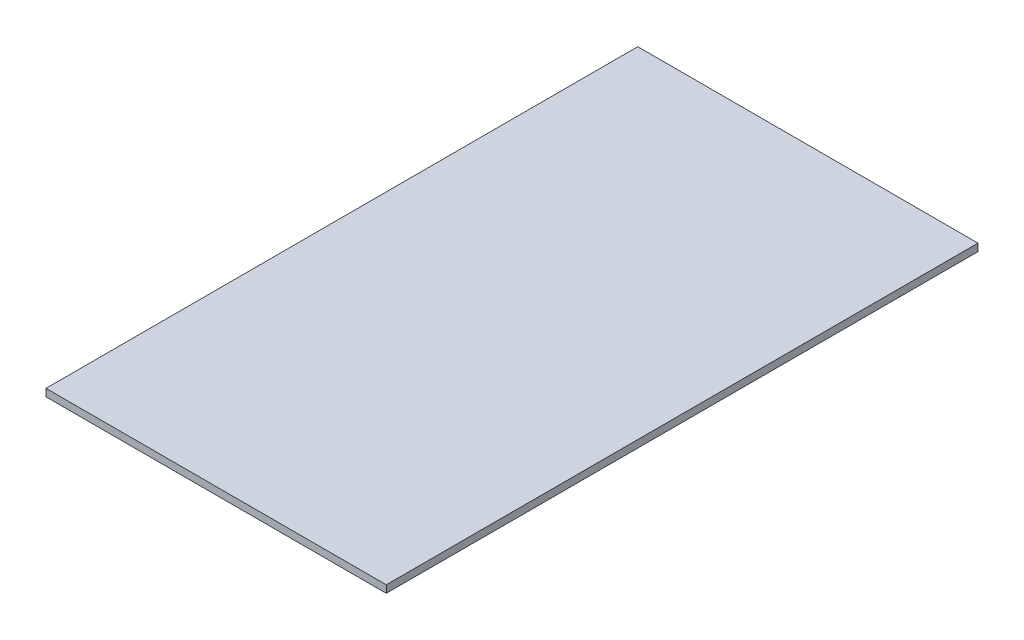
ISO-10303-21;
HEADER;
FILE_DESCRIPTION(('STEP AP214'),'2;1');
FILE_NAME('part.step','',(''),(''),'','','');
FILE_SCHEMA(('AUTOMOTIVE_DESIGN { 1 0 10303 214 1 1 1 1 }'));
ENDSEC;
DATA;
#1=APPLICATION_CONTEXT('core data for automotive mechanical design processes');
#2=APPLICATION_PROTOCOL_DEFINITION('international standard','automotive_design',2000,#1);
#3=PRODUCT_CONTEXT('',#1,'mechanical');
#4=PRODUCT('Part','Part','',(#3));
#5=PRODUCT_RELATED_PRODUCT_CATEGORY('part','',(#4));
#6=PRODUCT_DEFINITION_FORMATION('','',#4);
#7=PRODUCT_DEFINITION_CONTEXT('part definition',#1,'design');
#8=PRODUCT_DEFINITION('design','',#6,#7);
#9=PRODUCT_DEFINITION_SHAPE('','',#8);
#10=(LENGTH_UNIT() NAMED_UNIT(*) SI_UNIT(.MILLI.,.METRE.));
#11=(NAMED_UNIT(*) PLANE_ANGLE_UNIT() SI_UNIT($,.RADIAN.));
#12=(NAMED_UNIT(*) SI_UNIT($,.STERADIAN.) SOLID_ANGLE_UNIT());
#13=UNCERTAINTY_MEASURE_WITH_UNIT(LENGTH_MEASURE(1.E-05),#10,'distance_accuracy_value','');
#14=(GEOMETRIC_REPRESENTATION_CONTEXT(3) GLOBAL_UNCERTAINTY_ASSIGNED_CONTEXT((#13)) GLOBAL_UNIT_ASSIGNED_CONTEXT((#10,
#11,#12)) REPRESENTATION_CONTEXT('',''));
#15=CARTESIAN_POINT('',(0.,0.,0.));
#16=DIRECTION('',(0.,0.,1.));
#17=DIRECTION('',(1.,0.,0.));
#18=AXIS2_PLACEMENT_3D('',#15,#16,#17);
#19=CARTESIAN_POINT('',(0.92717059071068,6.35,22.9951434882447));
#20=DIRECTION('',(0.,0.,-1.));
#21=DIRECTION('',(-1.,0.,0.));
#22=AXIS2_PLACEMENT_3D('',#19,#20,#21);
#23=PLANE('',#22);
#24=DIRECTION('',(1.,0.,0.));
#25=VECTOR('',#24,1.);
#26=CARTESIAN_POINT('',(0.92717059071068,0.,22.9951434882447));
#27=LINE('',#26,#25);
#28=CARTESIAN_POINT('',(0.92717059071068,0.,22.9951434882447));
#29=VERTEX_POINT('',#28);
#30=CARTESIAN_POINT('',(293.027170590711,0.,22.9951434882446));
#31=VERTEX_POINT('',#30);
#32=EDGE_CURVE('E107',#29,#31,#27,.T.);
#33=ORIENTED_EDGE('',*,*,#32,.T.);
#34=DIRECTION('',(0.,-1.,0.));
#35=VECTOR('',#34,1.);
#36=CARTESIAN_POINT('',(293.027170590711,6.35,22.9951434882446));
#37=LINE('',#36,#35);
#38=CARTESIAN_POINT('',(293.027170590711,6.35,22.9951434882446));
#39=VERTEX_POINT('',#38);
#40=EDGE_CURVE('E11',#39,#31,#37,.T.);
#41=ORIENTED_EDGE('',*,*,#40,.F.);
#42=DIRECTION('',(1.,0.,0.));
#43=VECTOR('',#42,1.);
#44=CARTESIAN_POINT('',(0.92717059071068,6.35,22.9951434882447));
#45=LINE('',#44,#43);
#46=CARTESIAN_POINT('',(0.92717059071068,6.35,22.9951434882447));
#47=VERTEX_POINT('',#46);
#48=EDGE_CURVE('E89',#47,#39,#45,.T.);
#49=ORIENTED_EDGE('',*,*,#48,.F.);
#50=DIRECTION('',(0.,-1.,0.));
#51=VECTOR('',#50,1.);
#52=CARTESIAN_POINT('',(0.92717059071068,6.35,22.9951434882447));
#53=LINE('',#52,#51);
#54=EDGE_CURVE('E56',#47,#29,#53,.T.);
#55=ORIENTED_EDGE('',*,*,#54,.T.);
#56=EDGE_LOOP('',(#33,#41,#49,#55));
#57=FACE_BOUND('',#56,.T.);
#58=ADVANCED_FACE('F39',(#57),#23,.F.);
#59=CARTESIAN_POINT('',(293.027170590711,6.35,22.9951434882446));
#60=DIRECTION('',(-1.,0.,0.));
#61=DIRECTION('',(0.,0.,1.));
#62=AXIS2_PLACEMENT_3D('',#59,#60,#61);
#63=PLANE('',#62);
#64=DIRECTION('',(0.,0.,-1.));
#65=VECTOR('',#64,1.);
#66=CARTESIAN_POINT('',(293.027170590711,0.,22.9951434882446));
#67=LINE('',#66,#65);
#68=CARTESIAN_POINT('',(293.027170590711,0.,-485.004856511755));
#69=VERTEX_POINT('',#68);
#70=EDGE_CURVE('E95',#31,#69,#67,.T.);
#71=ORIENTED_EDGE('',*,*,#70,.T.);
#72=DIRECTION('',(0.,-1.,0.));
#73=VECTOR('',#72,1.);
#74=CARTESIAN_POINT('',(293.027170590711,6.35,-485.004856511755));
#75=LINE('',#74,#73);
#76=CARTESIAN_POINT('',(293.027170590711,6.35,-485.004856511755));
#77=VERTEX_POINT('',#76);
#78=EDGE_CURVE('E48',#77,#69,#75,.T.);
#79=ORIENTED_EDGE('',*,*,#78,.F.);
#80=DIRECTION('',(0.,0.,-1.));
#81=VECTOR('',#80,1.);
#82=CARTESIAN_POINT('',(293.027170590711,6.35,22.9951434882446));
#83=LINE('',#82,#81);
#84=EDGE_CURVE('E81',#39,#77,#83,.T.);
#85=ORIENTED_EDGE('',*,*,#84,.F.);
#86=ORIENTED_EDGE('',*,*,#40,.T.);
#87=EDGE_LOOP('',(#71,#79,#85,#86));
#88=FACE_BOUND('',#87,.T.);
#89=ADVANCED_FACE('F94',(#88),#63,.F.);
#90=CARTESIAN_POINT('',(0.92717059071068,6.35,-485.004856511755));
#91=DIRECTION('',(0.,0.,-1.));
#92=DIRECTION('',(-1.,0.,0.));
#93=AXIS2_PLACEMENT_3D('',#90,#91,#92);
#94=PLANE('',#93);
#95=DIRECTION('',(1.,0.,0.));
#96=VECTOR('',#95,1.);
#97=CARTESIAN_POINT('',(0.92717059071068,0.,-485.004856511755));
#98=LINE('',#97,#96);
#99=CARTESIAN_POINT('',(0.92717059071068,0.,-485.004856511755));
#100=VERTEX_POINT('',#99);
#101=EDGE_CURVE('E112',#100,#69,#98,.T.);
#102=ORIENTED_EDGE('',*,*,#101,.F.);
#103=DIRECTION('',(0.,-1.,0.));
#104=VECTOR('',#103,1.);
#105=CARTESIAN_POINT('',(0.92717059071068,6.35,-485.004856511755));
#106=LINE('',#105,#104);
#107=CARTESIAN_POINT('',(0.92717059071068,6.35,-485.004856511755));
#108=VERTEX_POINT('',#107);
#109=EDGE_CURVE('E70',#108,#100,#106,.T.);
#110=ORIENTED_EDGE('',*,*,#109,.F.);
#111=DIRECTION('',(1.,0.,0.));
#112=VECTOR('',#111,1.);
#113=CARTESIAN_POINT('',(0.92717059071068,6.35,-485.004856511755));
#114=LINE('',#113,#112);
#115=EDGE_CURVE('E88',#108,#77,#114,.T.);
#116=ORIENTED_EDGE('',*,*,#115,.T.);
#117=ORIENTED_EDGE('',*,*,#78,.T.);
#118=EDGE_LOOP('',(#102,#110,#116,#117));
#119=FACE_BOUND('',#118,.T.);
#120=ADVANCED_FACE('F99',(#119),#94,.T.);
#121=CARTESIAN_POINT('',(0.92717059071068,6.35,22.9951434882447));
#122=DIRECTION('',(-1.,0.,0.));
#123=DIRECTION('',(0.,0.,1.));
#124=AXIS2_PLACEMENT_3D('',#121,#122,#123);
#125=PLANE('',#124);
#126=DIRECTION('',(0.,0.,-1.));
#127=VECTOR('',#126,1.);
#128=CARTESIAN_POINT('',(0.92717059071068,0.,22.9951434882447));
#129=LINE('',#128,#127);
#130=EDGE_CURVE('E115',#29,#100,#129,.T.);
#131=ORIENTED_EDGE('',*,*,#130,.F.);
#132=ORIENTED_EDGE('',*,*,#54,.F.);
#133=DIRECTION('',(0.,0.,-1.));
#134=VECTOR('',#133,1.);
#135=CARTESIAN_POINT('',(0.92717059071068,6.35,22.9951434882447));
#136=LINE('',#135,#134);
#137=EDGE_CURVE('E101',#47,#108,#136,.T.);
#138=ORIENTED_EDGE('',*,*,#137,.T.);
#139=ORIENTED_EDGE('',*,*,#109,.T.);
#140=EDGE_LOOP('',(#131,#132,#138,#139));
#141=FACE_BOUND('',#140,.T.);
#142=ADVANCED_FACE('F125',(#141),#125,.T.);
#143=CARTESIAN_POINT('',(0.,6.35,0.));
#144=DIRECTION('',(0.,1.,0.));
#145=DIRECTION('',(0.,0.,1.));
#146=AXIS2_PLACEMENT_3D('',#143,#144,#145);
#147=PLANE('',#146);
#148=ORIENTED_EDGE('',*,*,#48,.T.);
#149=ORIENTED_EDGE('',*,*,#84,.T.);
#150=ORIENTED_EDGE('',*,*,#115,.F.);
#151=ORIENTED_EDGE('',*,*,#137,.F.);
#152=EDGE_LOOP('',(#148,#149,#150,#151));
#153=FACE_BOUND('',#152,.T.);
#154=ADVANCED_FACE('F85',(#153),#147,.T.);
#155=CARTESIAN_POINT('',(0.,0.,0.));
#156=DIRECTION('',(0.,1.,0.));
#157=DIRECTION('',(0.,0.,1.));
#158=AXIS2_PLACEMENT_3D('',#155,#156,#157);
#159=PLANE('',#158);
#160=ORIENTED_EDGE('',*,*,#32,.F.);
#161=ORIENTED_EDGE('',*,*,#130,.T.);
#162=ORIENTED_EDGE('',*,*,#101,.T.);
#163=ORIENTED_EDGE('',*,*,#70,.F.);
#164=EDGE_LOOP('',(#160,#161,#162,#163));
#165=FACE_BOUND('',#164,.T.);
#166=ADVANCED_FACE('F124',(#165),#159,.F.);
#167=CLOSED_SHELL('',(#58,#89,#120,#142,#154,#166));
#168=MANIFOLD_SOLID_BREP('B2',#167);
#169=ADVANCED_BREP_SHAPE_REPRESENTATION('',(#18,#168),#14);
#170=SHAPE_DEFINITION_REPRESENTATION(#9,#169);
ENDSEC;
END-ISO-10303-21;
